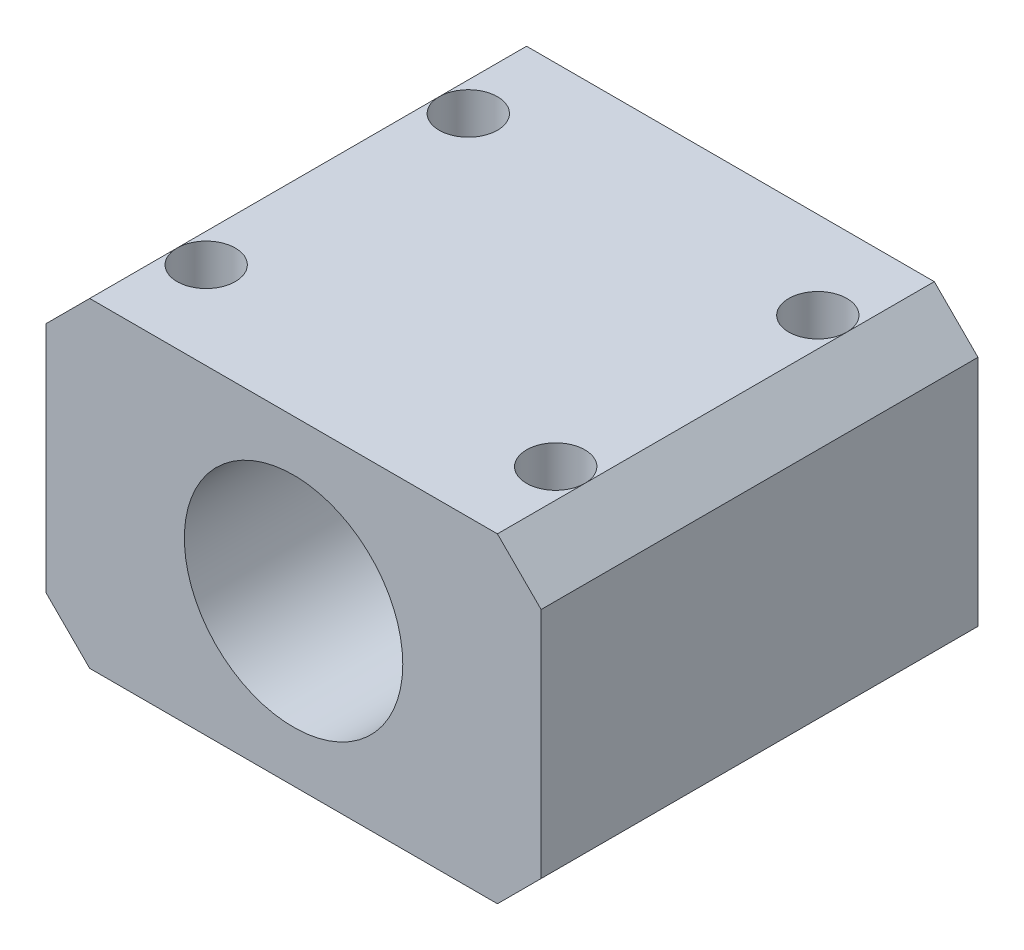
ISO-10303-21;
HEADER;
FILE_DESCRIPTION(('STEP AP214'),'2;1');
FILE_NAME('part.step','',(''),(''),'','','');
FILE_SCHEMA(('AUTOMOTIVE_DESIGN { 1 0 10303 214 1 1 1 1 }'));
ENDSEC;
DATA;
#1=APPLICATION_CONTEXT('core data for automotive mechanical design processes');
#2=APPLICATION_PROTOCOL_DEFINITION('international standard','automotive_design',2000,#1);
#3=PRODUCT_CONTEXT('',#1,'mechanical');
#4=PRODUCT('Part','Part','',(#3));
#5=PRODUCT_RELATED_PRODUCT_CATEGORY('part','',(#4));
#6=PRODUCT_DEFINITION_FORMATION('','',#4);
#7=PRODUCT_DEFINITION_CONTEXT('part definition',#1,'design');
#8=PRODUCT_DEFINITION('design','',#6,#7);
#9=PRODUCT_DEFINITION_SHAPE('','',#8);
#10=(LENGTH_UNIT() NAMED_UNIT(*) SI_UNIT(.MILLI.,.METRE.));
#11=(NAMED_UNIT(*) PLANE_ANGLE_UNIT() SI_UNIT($,.RADIAN.));
#12=(NAMED_UNIT(*) SI_UNIT($,.STERADIAN.) SOLID_ANGLE_UNIT());
#13=UNCERTAINTY_MEASURE_WITH_UNIT(LENGTH_MEASURE(1.E-05),#10,'distance_accuracy_value','');
#14=(GEOMETRIC_REPRESENTATION_CONTEXT(3) GLOBAL_UNCERTAINTY_ASSIGNED_CONTEXT((#13)) GLOBAL_UNIT_ASSIGNED_CONTEXT((#10,
#11,#12)) REPRESENTATION_CONTEXT('',''));
#15=CARTESIAN_POINT('',(0.,0.,0.));
#16=DIRECTION('',(0.,0.,1.));
#17=DIRECTION('',(1.,0.,0.));
#18=AXIS2_PLACEMENT_3D('',#15,#16,#17);
#19=CARTESIAN_POINT('',(0.,0.,30.));
#20=DIRECTION('',(0.,0.,-1.));
#21=DIRECTION('',(-1.,0.,0.));
#22=AXIS2_PLACEMENT_3D('',#19,#20,#21);
#23=PLANE('',#22);
#24=DIRECTION('',(-1.,0.,0.));
#25=VECTOR('',#24,1.);
#26=CARTESIAN_POINT('',(-17.,0.,30.));
#27=LINE('',#26,#25);
#28=CARTESIAN_POINT('',(14.,0.,30.));
#29=VERTEX_POINT('',#28);
#30=CARTESIAN_POINT('',(-14.,0.,30.));
#31=VERTEX_POINT('',#30);
#32=EDGE_CURVE('E227',#29,#31,#27,.T.);
#33=ORIENTED_EDGE('',*,*,#32,.T.);
#34=DIRECTION('',(0.707106781186548,0.707106781186547,0.));
#35=VECTOR('',#34,1.);
#36=CARTESIAN_POINT('',(-17.,-3.00000000000001,30.));
#37=LINE('',#36,#35);
#38=CARTESIAN_POINT('',(-17.,-3.00000000000001,30.));
#39=VERTEX_POINT('',#38);
#40=EDGE_CURVE('E200',#31,#39,#37,.F.);
#41=ORIENTED_EDGE('',*,*,#40,.T.);
#42=DIRECTION('',(0.,-1.,0.));
#43=VECTOR('',#42,1.);
#44=CARTESIAN_POINT('',(-17.,0.,30.));
#45=LINE('',#44,#43);
#46=CARTESIAN_POINT('',(-17.,-19.,30.));
#47=VERTEX_POINT('',#46);
#48=EDGE_CURVE('E149',#39,#47,#45,.T.);
#49=ORIENTED_EDGE('',*,*,#48,.T.);
#50=DIRECTION('',(-0.707106781186547,0.707106781186548,0.));
#51=VECTOR('',#50,1.);
#52=CARTESIAN_POINT('',(-14.,-22.,30.));
#53=LINE('',#52,#51);
#54=CARTESIAN_POINT('',(-14.,-22.,30.));
#55=VERTEX_POINT('',#54);
#56=EDGE_CURVE('E196',#47,#55,#53,.F.);
#57=ORIENTED_EDGE('',*,*,#56,.T.);
#58=DIRECTION('',(1.,0.,0.));
#59=VECTOR('',#58,1.);
#60=CARTESIAN_POINT('',(17.,-22.,30.));
#61=LINE('',#60,#59);
#62=CARTESIAN_POINT('',(14.,-22.,30.));
#63=VERTEX_POINT('',#62);
#64=EDGE_CURVE('E178',#55,#63,#61,.T.);
#65=ORIENTED_EDGE('',*,*,#64,.T.);
#66=DIRECTION('',(-0.707106781186548,-0.707106781186547,0.));
#67=VECTOR('',#66,1.);
#68=CARTESIAN_POINT('',(17.,-19.,30.));
#69=LINE('',#68,#67);
#70=CARTESIAN_POINT('',(17.,-19.,30.));
#71=VERTEX_POINT('',#70);
#72=EDGE_CURVE('E194',#63,#71,#69,.F.);
#73=ORIENTED_EDGE('',*,*,#72,.T.);
#74=DIRECTION('',(0.,1.,0.));
#75=VECTOR('',#74,1.);
#76=CARTESIAN_POINT('',(17.,0.,30.));
#77=LINE('',#76,#75);
#78=CARTESIAN_POINT('',(17.,-3.00000000000002,30.));
#79=VERTEX_POINT('',#78);
#80=EDGE_CURVE('E162',#71,#79,#77,.T.);
#81=ORIENTED_EDGE('',*,*,#80,.T.);
#82=DIRECTION('',(0.707106781186547,-0.707106781186548,0.));
#83=VECTOR('',#82,1.);
#84=CARTESIAN_POINT('',(14.,0.,30.));
#85=LINE('',#84,#83);
#86=EDGE_CURVE('E198',#79,#29,#85,.F.);
#87=ORIENTED_EDGE('',*,*,#86,.T.);
#88=EDGE_LOOP('',(#33,#41,#49,#57,#65,#73,#81,#87));
#89=FACE_BOUND('',#88,.T.);
#90=CARTESIAN_POINT('',(0.,-11.,30.));
#91=DIRECTION('',(0.,0.,1.));
#92=DIRECTION('',(1.,0.,0.));
#93=AXIS2_PLACEMENT_3D('',#90,#91,#92);
#94=CIRCLE('',#93,7.5);
#95=CARTESIAN_POINT('',(7.5,-11.,30.));
#96=VERTEX_POINT('',#95);
#97=EDGE_CURVE('E233',#96,#96,#94,.T.);
#98=ORIENTED_EDGE('',*,*,#97,.F.);
#99=EDGE_LOOP('',(#98));
#100=FACE_BOUND('',#99,.T.);
#101=ADVANCED_FACE('F39',(#89,#100),#23,.F.);
#102=CARTESIAN_POINT('',(0.,0.,0.));
#103=DIRECTION('',(0.,0.,-1.));
#104=DIRECTION('',(-1.,0.,0.));
#105=AXIS2_PLACEMENT_3D('',#102,#103,#104);
#106=PLANE('',#105);
#107=DIRECTION('',(0.,-1.,0.));
#108=VECTOR('',#107,1.);
#109=CARTESIAN_POINT('',(-17.,0.,0.));
#110=LINE('',#109,#108);
#111=CARTESIAN_POINT('',(-17.,-3.00000000000001,0.));
#112=VERTEX_POINT('',#111);
#113=CARTESIAN_POINT('',(-17.,-19.,0.));
#114=VERTEX_POINT('',#113);
#115=EDGE_CURVE('E146',#112,#114,#110,.T.);
#116=ORIENTED_EDGE('',*,*,#115,.F.);
#117=DIRECTION('',(-0.707106781186548,-0.707106781186547,0.));
#118=VECTOR('',#117,1.);
#119=CARTESIAN_POINT('',(-6.99999999999998,6.99999999999999,0.));
#120=LINE('',#119,#118);
#121=CARTESIAN_POINT('',(-14.,0.,0.));
#122=VERTEX_POINT('',#121);
#123=EDGE_CURVE('E128',#112,#122,#120,.F.);
#124=ORIENTED_EDGE('',*,*,#123,.T.);
#125=DIRECTION('',(-1.,0.,0.));
#126=VECTOR('',#125,1.);
#127=CARTESIAN_POINT('',(-17.,0.,0.));
#128=LINE('',#127,#126);
#129=CARTESIAN_POINT('',(14.,0.,0.));
#130=VERTEX_POINT('',#129);
#131=EDGE_CURVE('E159',#130,#122,#128,.T.);
#132=ORIENTED_EDGE('',*,*,#131,.F.);
#133=DIRECTION('',(-0.707106781186547,0.707106781186548,0.));
#134=VECTOR('',#133,1.);
#135=CARTESIAN_POINT('',(7.00000000000001,6.99999999999999,0.));
#136=LINE('',#135,#134);
#137=CARTESIAN_POINT('',(17.,-3.00000000000002,0.));
#138=VERTEX_POINT('',#137);
#139=EDGE_CURVE('E140',#130,#138,#136,.F.);
#140=ORIENTED_EDGE('',*,*,#139,.T.);
#141=DIRECTION('',(0.,1.,0.));
#142=VECTOR('',#141,1.);
#143=CARTESIAN_POINT('',(17.,0.,0.));
#144=LINE('',#143,#142);
#145=CARTESIAN_POINT('',(17.,-19.,0.));
#146=VERTEX_POINT('',#145);
#147=EDGE_CURVE('E164',#146,#138,#144,.T.);
#148=ORIENTED_EDGE('',*,*,#147,.F.);
#149=DIRECTION('',(0.707106781186548,0.707106781186547,0.));
#150=VECTOR('',#149,1.);
#151=CARTESIAN_POINT('',(18.,-18.,0.));
#152=LINE('',#151,#150);
#153=CARTESIAN_POINT('',(14.,-22.,0.));
#154=VERTEX_POINT('',#153);
#155=EDGE_CURVE('E150',#146,#154,#152,.F.);
#156=ORIENTED_EDGE('',*,*,#155,.T.);
#157=DIRECTION('',(1.,0.,0.));
#158=VECTOR('',#157,1.);
#159=CARTESIAN_POINT('',(17.,-22.,0.));
#160=LINE('',#159,#158);
#161=CARTESIAN_POINT('',(-14.,-22.,0.));
#162=VERTEX_POINT('',#161);
#163=EDGE_CURVE('E158',#162,#154,#160,.T.);
#164=ORIENTED_EDGE('',*,*,#163,.F.);
#165=DIRECTION('',(0.707106781186547,-0.707106781186548,0.));
#166=VECTOR('',#165,1.);
#167=CARTESIAN_POINT('',(-18.,-18.,0.));
#168=LINE('',#167,#166);
#169=EDGE_CURVE('E157',#162,#114,#168,.F.);
#170=ORIENTED_EDGE('',*,*,#169,.T.);
#171=EDGE_LOOP('',(#116,#124,#132,#140,#148,#156,#164,#170));
#172=FACE_BOUND('',#171,.T.);
#173=CARTESIAN_POINT('',(0.,-11.,0.));
#174=DIRECTION('',(0.,0.,1.));
#175=DIRECTION('',(1.,0.,0.));
#176=AXIS2_PLACEMENT_3D('',#173,#174,#175);
#177=CIRCLE('',#176,7.5);
#178=CARTESIAN_POINT('',(7.5,-11.,0.));
#179=VERTEX_POINT('',#178);
#180=EDGE_CURVE('E177',#179,#179,#177,.T.);
#181=ORIENTED_EDGE('',*,*,#180,.T.);
#182=EDGE_LOOP('',(#181));
#183=FACE_BOUND('',#182,.T.);
#184=ADVANCED_FACE('F153',(#172,#183),#106,.T.);
#185=CARTESIAN_POINT('',(17.,0.,30.));
#186=DIRECTION('',(-1.,0.,0.));
#187=DIRECTION('',(0.,-1.,0.));
#188=AXIS2_PLACEMENT_3D('',#185,#186,#187);
#189=PLANE('',#188);
#190=ORIENTED_EDGE('',*,*,#147,.T.);
#191=DIRECTION('',(0.,0.,1.));
#192=VECTOR('',#191,1.);
#193=CARTESIAN_POINT('',(17.,-3.00000000000002,30.));
#194=LINE('',#193,#192);
#195=EDGE_CURVE('E205',#138,#79,#194,.T.);
#196=ORIENTED_EDGE('',*,*,#195,.T.);
#197=ORIENTED_EDGE('',*,*,#80,.F.);
#198=DIRECTION('',(0.,0.,-1.));
#199=VECTOR('',#198,1.);
#200=CARTESIAN_POINT('',(17.,-19.,30.));
#201=LINE('',#200,#199);
#202=EDGE_CURVE('E202',#71,#146,#201,.T.);
#203=ORIENTED_EDGE('',*,*,#202,.T.);
#204=EDGE_LOOP('',(#190,#196,#197,#203));
#205=FACE_BOUND('',#204,.T.);
#206=ADVANCED_FACE('F287',(#205),#189,.F.);
#207=CARTESIAN_POINT('',(-17.,0.,30.));
#208=DIRECTION('',(0.,-1.,0.));
#209=DIRECTION('',(0.,0.,-1.));
#210=AXIS2_PLACEMENT_3D('',#207,#208,#209);
#211=PLANE('',#210);
#212=ORIENTED_EDGE('',*,*,#131,.T.);
#213=DIRECTION('',(0.,0.,1.));
#214=VECTOR('',#213,1.);
#215=CARTESIAN_POINT('',(-14.,0.,30.));
#216=LINE('',#215,#214);
#217=CARTESIAN_POINT('',(-14.,0.,6.));
#218=VERTEX_POINT('',#217);
#219=EDGE_CURVE('E134',#122,#218,#216,.T.);
#220=ORIENTED_EDGE('',*,*,#219,.T.);
#221=CARTESIAN_POINT('',(-12.,0.,6.));
#222=DIRECTION('',(0.,1.,0.));
#223=DIRECTION('',(0.,0.,1.));
#224=AXIS2_PLACEMENT_3D('',#221,#222,#223);
#225=CIRCLE('',#224,2.);
#226=EDGE_CURVE('E171',#218,#218,#225,.T.);
#227=ORIENTED_EDGE('',*,*,#226,.F.);
#228=DIRECTION('',(0.,0.,1.));
#229=VECTOR('',#228,1.);
#230=CARTESIAN_POINT('',(-14.,0.,30.));
#231=LINE('',#230,#229);
#232=CARTESIAN_POINT('',(-14.,0.,24.));
#233=VERTEX_POINT('',#232);
#234=EDGE_CURVE('E191',#218,#233,#231,.T.);
#235=ORIENTED_EDGE('',*,*,#234,.T.);
#236=CARTESIAN_POINT('',(-12.,0.,24.));
#237=DIRECTION('',(0.,1.,0.));
#238=DIRECTION('',(0.,0.,1.));
#239=AXIS2_PLACEMENT_3D('',#236,#237,#238);
#240=CIRCLE('',#239,2.);
#241=EDGE_CURVE('E263',#233,#233,#240,.T.);
#242=ORIENTED_EDGE('',*,*,#241,.F.);
#243=DIRECTION('',(0.,0.,1.));
#244=VECTOR('',#243,1.);
#245=CARTESIAN_POINT('',(-14.,0.,30.));
#246=LINE('',#245,#244);
#247=EDGE_CURVE('E189',#233,#31,#246,.T.);
#248=ORIENTED_EDGE('',*,*,#247,.T.);
#249=ORIENTED_EDGE('',*,*,#32,.F.);
#250=DIRECTION('',(0.,0.,-1.));
#251=VECTOR('',#250,1.);
#252=CARTESIAN_POINT('',(14.,0.,30.));
#253=LINE('',#252,#251);
#254=CARTESIAN_POINT('',(14.,0.,24.));
#255=VERTEX_POINT('',#254);
#256=EDGE_CURVE('E186',#29,#255,#253,.T.);
#257=ORIENTED_EDGE('',*,*,#256,.T.);
#258=CARTESIAN_POINT('',(12.,0.,24.));
#259=DIRECTION('',(0.,1.,0.));
#260=DIRECTION('',(0.,0.,1.));
#261=AXIS2_PLACEMENT_3D('',#258,#259,#260);
#262=CIRCLE('',#261,2.);
#263=EDGE_CURVE('E259',#255,#255,#262,.T.);
#264=ORIENTED_EDGE('',*,*,#263,.F.);
#265=DIRECTION('',(0.,0.,-1.));
#266=VECTOR('',#265,1.);
#267=CARTESIAN_POINT('',(14.,0.,30.));
#268=LINE('',#267,#266);
#269=CARTESIAN_POINT('',(14.,0.,6.));
#270=VERTEX_POINT('',#269);
#271=EDGE_CURVE('E184',#255,#270,#268,.T.);
#272=ORIENTED_EDGE('',*,*,#271,.T.);
#273=CARTESIAN_POINT('',(12.,0.,6.));
#274=DIRECTION('',(0.,1.,0.));
#275=DIRECTION('',(0.,0.,1.));
#276=AXIS2_PLACEMENT_3D('',#273,#274,#275);
#277=CIRCLE('',#276,2.);
#278=EDGE_CURVE('E266',#270,#270,#277,.T.);
#279=ORIENTED_EDGE('',*,*,#278,.F.);
#280=DIRECTION('',(0.,0.,-1.));
#281=VECTOR('',#280,1.);
#282=CARTESIAN_POINT('',(14.,0.,30.));
#283=LINE('',#282,#281);
#284=EDGE_CURVE('E139',#270,#130,#283,.T.);
#285=ORIENTED_EDGE('',*,*,#284,.T.);
#286=EDGE_LOOP('',(#212,#220,#227,#235,#242,#248,#249,#257,#264,#272,#279,#285));
#287=FACE_BOUND('',#286,.T.);
#288=ADVANCED_FACE('F258',(#287),#211,.F.);
#289=CARTESIAN_POINT('',(-17.,0.,30.));
#290=DIRECTION('',(1.,0.,0.));
#291=DIRECTION('',(0.,1.,0.));
#292=AXIS2_PLACEMENT_3D('',#289,#290,#291);
#293=PLANE('',#292);
#294=ORIENTED_EDGE('',*,*,#48,.F.);
#295=DIRECTION('',(0.,0.,-1.));
#296=VECTOR('',#295,1.);
#297=CARTESIAN_POINT('',(-17.,-3.00000000000001,30.));
#298=LINE('',#297,#296);
#299=EDGE_CURVE('E133',#39,#112,#298,.T.);
#300=ORIENTED_EDGE('',*,*,#299,.T.);
#301=ORIENTED_EDGE('',*,*,#115,.T.);
#302=DIRECTION('',(0.,0.,1.));
#303=VECTOR('',#302,1.);
#304=CARTESIAN_POINT('',(-17.,-19.,30.));
#305=LINE('',#304,#303);
#306=EDGE_CURVE('E151',#114,#47,#305,.T.);
#307=ORIENTED_EDGE('',*,*,#306,.T.);
#308=EDGE_LOOP('',(#294,#300,#301,#307));
#309=FACE_BOUND('',#308,.T.);
#310=ADVANCED_FACE('F145',(#309),#293,.F.);
#311=CARTESIAN_POINT('',(17.,-22.,30.));
#312=DIRECTION('',(0.,1.,0.));
#313=DIRECTION('',(0.,0.,1.));
#314=AXIS2_PLACEMENT_3D('',#311,#312,#313);
#315=PLANE('',#314);
#316=ORIENTED_EDGE('',*,*,#64,.F.);
#317=DIRECTION('',(0.,0.,-1.));
#318=VECTOR('',#317,1.);
#319=CARTESIAN_POINT('',(-14.,-22.,30.));
#320=LINE('',#319,#318);
#321=CARTESIAN_POINT('',(-14.,-22.,24.));
#322=VERTEX_POINT('',#321);
#323=EDGE_CURVE('E11',#55,#322,#320,.T.);
#324=ORIENTED_EDGE('',*,*,#323,.T.);
#325=CARTESIAN_POINT('',(-12.,-22.,24.));
#326=DIRECTION('',(0.,1.,0.));
#327=DIRECTION('',(0.,0.,1.));
#328=AXIS2_PLACEMENT_3D('',#325,#326,#327);
#329=CIRCLE('',#328,2.);
#330=EDGE_CURVE('E173',#322,#322,#329,.T.);
#331=ORIENTED_EDGE('',*,*,#330,.T.);
#332=DIRECTION('',(0.,0.,-1.));
#333=VECTOR('',#332,1.);
#334=CARTESIAN_POINT('',(-14.,-22.,30.));
#335=LINE('',#334,#333);
#336=CARTESIAN_POINT('',(-14.,-22.,6.));
#337=VERTEX_POINT('',#336);
#338=EDGE_CURVE('E48',#322,#337,#335,.T.);
#339=ORIENTED_EDGE('',*,*,#338,.T.);
#340=CARTESIAN_POINT('',(-12.,-22.,6.));
#341=DIRECTION('',(0.,1.,0.));
#342=DIRECTION('',(0.,0.,1.));
#343=AXIS2_PLACEMENT_3D('',#340,#341,#342);
#344=CIRCLE('',#343,2.);
#345=EDGE_CURVE('E168',#337,#337,#344,.T.);
#346=ORIENTED_EDGE('',*,*,#345,.T.);
#347=DIRECTION('',(0.,0.,-1.));
#348=VECTOR('',#347,1.);
#349=CARTESIAN_POINT('',(-14.,-22.,30.));
#350=LINE('',#349,#348);
#351=EDGE_CURVE('E212',#337,#162,#350,.T.);
#352=ORIENTED_EDGE('',*,*,#351,.T.);
#353=ORIENTED_EDGE('',*,*,#163,.T.);
#354=DIRECTION('',(0.,0.,1.));
#355=VECTOR('',#354,1.);
#356=CARTESIAN_POINT('',(14.,-22.,30.));
#357=LINE('',#356,#355);
#358=CARTESIAN_POINT('',(14.,-22.,6.));
#359=VERTEX_POINT('',#358);
#360=EDGE_CURVE('E210',#154,#359,#357,.T.);
#361=ORIENTED_EDGE('',*,*,#360,.T.);
#362=CARTESIAN_POINT('',(12.,-22.,6.));
#363=DIRECTION('',(0.,1.,0.));
#364=DIRECTION('',(0.,0.,1.));
#365=AXIS2_PLACEMENT_3D('',#362,#363,#364);
#366=CIRCLE('',#365,2.);
#367=EDGE_CURVE('E175',#359,#359,#366,.T.);
#368=ORIENTED_EDGE('',*,*,#367,.T.);
#369=DIRECTION('',(0.,0.,1.));
#370=VECTOR('',#369,1.);
#371=CARTESIAN_POINT('',(14.,-22.,30.));
#372=LINE('',#371,#370);
#373=CARTESIAN_POINT('',(14.,-22.,24.));
#374=VERTEX_POINT('',#373);
#375=EDGE_CURVE('E60',#359,#374,#372,.T.);
#376=ORIENTED_EDGE('',*,*,#375,.T.);
#377=CARTESIAN_POINT('',(12.,-22.,24.));
#378=DIRECTION('',(0.,1.,0.));
#379=DIRECTION('',(0.,0.,1.));
#380=AXIS2_PLACEMENT_3D('',#377,#378,#379);
#381=CIRCLE('',#380,2.);
#382=EDGE_CURVE('E170',#374,#374,#381,.T.);
#383=ORIENTED_EDGE('',*,*,#382,.T.);
#384=DIRECTION('',(0.,0.,1.));
#385=VECTOR('',#384,1.);
#386=CARTESIAN_POINT('',(14.,-22.,30.));
#387=LINE('',#386,#385);
#388=EDGE_CURVE('E207',#374,#63,#387,.T.);
#389=ORIENTED_EDGE('',*,*,#388,.T.);
#390=EDGE_LOOP('',(#316,#324,#331,#339,#346,#352,#353,#361,#368,#376,#383,#389));
#391=FACE_BOUND('',#390,.T.);
#392=ADVANCED_FACE('F215',(#391),#315,.F.);
#393=CARTESIAN_POINT('',(0.,-11.,30.));
#394=DIRECTION('',(0.,0.,-1.));
#395=DIRECTION('',(-1.,0.,0.));
#396=AXIS2_PLACEMENT_3D('',#393,#394,#395);
#397=CYLINDRICAL_SURFACE('',#396,7.5);
#398=ORIENTED_EDGE('',*,*,#97,.T.);
#399=EDGE_LOOP('',(#398));
#400=FACE_BOUND('',#399,.T.);
#401=ORIENTED_EDGE('',*,*,#180,.F.);
#402=EDGE_LOOP('',(#401));
#403=FACE_BOUND('',#402,.T.);
#404=ADVANCED_FACE('F302',(#400,#403),#397,.F.);
#405=CARTESIAN_POINT('',(-12.,-30.,6.));
#406=DIRECTION('',(0.,1.,0.));
#407=DIRECTION('',(0.,0.,1.));
#408=AXIS2_PLACEMENT_3D('',#405,#406,#407);
#409=CYLINDRICAL_SURFACE('',#408,2.);
#410=ORIENTED_EDGE('',*,*,#226,.T.);
#411=EDGE_LOOP('',(#410));
#412=FACE_BOUND('',#411,.T.);
#413=ORIENTED_EDGE('',*,*,#345,.F.);
#414=EDGE_LOOP('',(#413));
#415=FACE_BOUND('',#414,.T.);
#416=ADVANCED_FACE('F274',(#412,#415),#409,.F.);
#417=CARTESIAN_POINT('',(12.,-30.,24.));
#418=DIRECTION('',(0.,1.,0.));
#419=DIRECTION('',(0.,0.,1.));
#420=AXIS2_PLACEMENT_3D('',#417,#418,#419);
#421=CYLINDRICAL_SURFACE('',#420,2.);
#422=ORIENTED_EDGE('',*,*,#263,.T.);
#423=EDGE_LOOP('',(#422));
#424=FACE_BOUND('',#423,.T.);
#425=ORIENTED_EDGE('',*,*,#382,.F.);
#426=EDGE_LOOP('',(#425));
#427=FACE_BOUND('',#426,.T.);
#428=ADVANCED_FACE('F261',(#424,#427),#421,.F.);
#429=CARTESIAN_POINT('',(-12.,-30.,24.));
#430=DIRECTION('',(0.,1.,0.));
#431=DIRECTION('',(0.,0.,1.));
#432=AXIS2_PLACEMENT_3D('',#429,#430,#431);
#433=CYLINDRICAL_SURFACE('',#432,2.);
#434=ORIENTED_EDGE('',*,*,#241,.T.);
#435=EDGE_LOOP('',(#434));
#436=FACE_BOUND('',#435,.T.);
#437=ORIENTED_EDGE('',*,*,#330,.F.);
#438=EDGE_LOOP('',(#437));
#439=FACE_BOUND('',#438,.T.);
#440=ADVANCED_FACE('F279',(#436,#439),#433,.F.);
#441=CARTESIAN_POINT('',(12.,-30.,6.));
#442=DIRECTION('',(0.,1.,0.));
#443=DIRECTION('',(0.,0.,1.));
#444=AXIS2_PLACEMENT_3D('',#441,#442,#443);
#445=CYLINDRICAL_SURFACE('',#444,2.);
#446=ORIENTED_EDGE('',*,*,#278,.T.);
#447=EDGE_LOOP('',(#446));
#448=FACE_BOUND('',#447,.T.);
#449=ORIENTED_EDGE('',*,*,#367,.F.);
#450=EDGE_LOOP('',(#449));
#451=FACE_BOUND('',#450,.T.);
#452=ADVANCED_FACE('F282',(#448,#451),#445,.F.);
#453=CARTESIAN_POINT('',(-17.,-3.00000000000001,30.));
#454=DIRECTION('',(0.707106781186547,-0.707106781186548,0.));
#455=DIRECTION('',(0.,0.,-1.));
#456=AXIS2_PLACEMENT_3D('',#453,#454,#455);
#457=PLANE('',#456);
#458=ORIENTED_EDGE('',*,*,#234,.F.);
#459=ORIENTED_EDGE('',*,*,#219,.F.);
#460=ORIENTED_EDGE('',*,*,#123,.F.);
#461=ORIENTED_EDGE('',*,*,#299,.F.);
#462=ORIENTED_EDGE('',*,*,#40,.F.);
#463=ORIENTED_EDGE('',*,*,#247,.F.);
#464=EDGE_LOOP('',(#458,#459,#460,#461,#462,#463));
#465=FACE_BOUND('',#464,.T.);
#466=ADVANCED_FACE('F131',(#465),#457,.F.);
#467=CARTESIAN_POINT('',(14.,0.,30.));
#468=DIRECTION('',(-0.707106781186548,-0.707106781186547,0.));
#469=DIRECTION('',(0.,0.,-1.));
#470=AXIS2_PLACEMENT_3D('',#467,#468,#469);
#471=PLANE('',#470);
#472=ORIENTED_EDGE('',*,*,#86,.F.);
#473=ORIENTED_EDGE('',*,*,#195,.F.);
#474=ORIENTED_EDGE('',*,*,#139,.F.);
#475=ORIENTED_EDGE('',*,*,#284,.F.);
#476=ORIENTED_EDGE('',*,*,#271,.F.);
#477=ORIENTED_EDGE('',*,*,#256,.F.);
#478=EDGE_LOOP('',(#472,#473,#474,#475,#476,#477));
#479=FACE_BOUND('',#478,.T.);
#480=ADVANCED_FACE('F252',(#479),#471,.F.);
#481=CARTESIAN_POINT('',(-14.,-22.,30.));
#482=DIRECTION('',(0.707106781186548,0.707106781186547,0.));
#483=DIRECTION('',(0.,0.,-1.));
#484=AXIS2_PLACEMENT_3D('',#481,#482,#483);
#485=PLANE('',#484);
#486=ORIENTED_EDGE('',*,*,#56,.F.);
#487=ORIENTED_EDGE('',*,*,#306,.F.);
#488=ORIENTED_EDGE('',*,*,#169,.F.);
#489=ORIENTED_EDGE('',*,*,#351,.F.);
#490=ORIENTED_EDGE('',*,*,#338,.F.);
#491=ORIENTED_EDGE('',*,*,#323,.F.);
#492=EDGE_LOOP('',(#486,#487,#488,#489,#490,#491));
#493=FACE_BOUND('',#492,.T.);
#494=ADVANCED_FACE('F221',(#493),#485,.F.);
#495=CARTESIAN_POINT('',(17.,-19.,30.));
#496=DIRECTION('',(-0.707106781186547,0.707106781186548,0.));
#497=DIRECTION('',(0.,0.,-1.));
#498=AXIS2_PLACEMENT_3D('',#495,#496,#497);
#499=PLANE('',#498);
#500=ORIENTED_EDGE('',*,*,#375,.F.);
#501=ORIENTED_EDGE('',*,*,#360,.F.);
#502=ORIENTED_EDGE('',*,*,#155,.F.);
#503=ORIENTED_EDGE('',*,*,#202,.F.);
#504=ORIENTED_EDGE('',*,*,#72,.F.);
#505=ORIENTED_EDGE('',*,*,#388,.F.);
#506=EDGE_LOOP('',(#500,#501,#502,#503,#504,#505));
#507=FACE_BOUND('',#506,.T.);
#508=ADVANCED_FACE('F42',(#507),#499,.F.);
#509=CLOSED_SHELL('',(#101,#184,#206,#288,#310,#392,#404,#416,#428,#440,#452,#466,#480,#494,#508));
#510=MANIFOLD_SOLID_BREP('B2',#509);
#511=ADVANCED_BREP_SHAPE_REPRESENTATION('',(#18,#510),#14);
#512=SHAPE_DEFINITION_REPRESENTATION(#9,#511);
ENDSEC;
END-ISO-10303-21;
